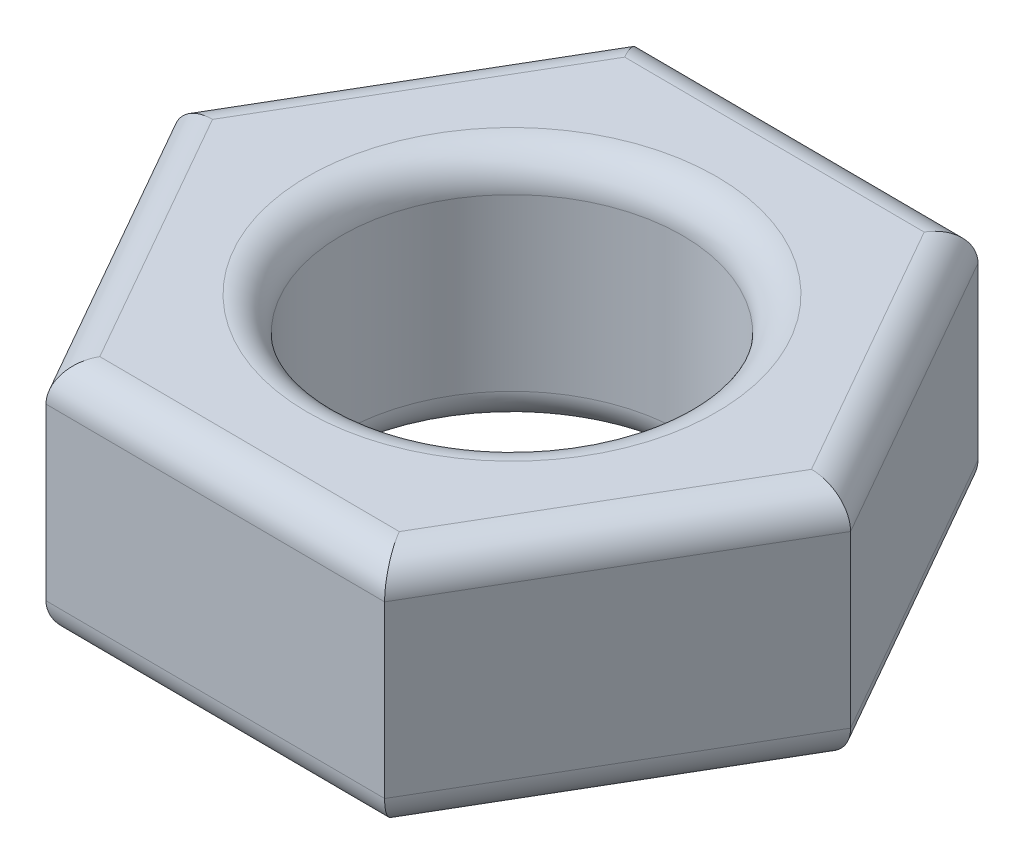
ISO-10303-21;
HEADER;
FILE_DESCRIPTION(('STEP AP214'),'2;1');
FILE_NAME('part.step','',(''),(''),'','','');
FILE_SCHEMA(('AUTOMOTIVE_DESIGN { 1 0 10303 214 1 1 1 1 }'));
ENDSEC;
DATA;
#1=APPLICATION_CONTEXT('core data for automotive mechanical design processes');
#2=APPLICATION_PROTOCOL_DEFINITION('international standard','automotive_design',2000,#1);
#3=PRODUCT_CONTEXT('',#1,'mechanical');
#4=PRODUCT('Part','Part','',(#3));
#5=PRODUCT_RELATED_PRODUCT_CATEGORY('part','',(#4));
#6=PRODUCT_DEFINITION_FORMATION('','',#4);
#7=PRODUCT_DEFINITION_CONTEXT('part definition',#1,'design');
#8=PRODUCT_DEFINITION('design','',#6,#7);
#9=PRODUCT_DEFINITION_SHAPE('','',#8);
#10=(LENGTH_UNIT() NAMED_UNIT(*) SI_UNIT(.MILLI.,.METRE.));
#11=(NAMED_UNIT(*) PLANE_ANGLE_UNIT() SI_UNIT($,.RADIAN.));
#12=(NAMED_UNIT(*) SI_UNIT($,.STERADIAN.) SOLID_ANGLE_UNIT());
#13=UNCERTAINTY_MEASURE_WITH_UNIT(LENGTH_MEASURE(1.E-05),#10,'distance_accuracy_value','');
#14=(GEOMETRIC_REPRESENTATION_CONTEXT(3) GLOBAL_UNCERTAINTY_ASSIGNED_CONTEXT((#13)) GLOBAL_UNIT_ASSIGNED_CONTEXT((#10,
#11,#12)) REPRESENTATION_CONTEXT('',''));
#15=CARTESIAN_POINT('',(0.,0.,0.));
#16=DIRECTION('',(0.,0.,1.));
#17=DIRECTION('',(1.,0.,0.));
#18=AXIS2_PLACEMENT_3D('',#15,#16,#17);
#19=CARTESIAN_POINT('',(0.,7.,0.));
#20=DIRECTION('',(0.,-1.,0.));
#21=DIRECTION('',(0.,0.,-1.));
#22=AXIS2_PLACEMENT_3D('',#19,#20,#21);
#23=PLANE('',#22);
#24=DIRECTION('',(-0.999982747889955,0.,-0.00587400395435439));
#25=VECTOR('',#24,1.);
#26=CARTESIAN_POINT('',(-4.95500275985404,7.,-7.68964181642976));
#27=LINE('',#26,#25);
#28=CARTESIAN_POINT('',(4.46765693146672,7.,-7.63429212124337));
#29=VERTEX_POINT('',#28);
#30=CARTESIAN_POINT('',(-4.3776624511748,7.,-7.68625045866549));
#31=VERTEX_POINT('',#30);
#32=EDGE_CURVE('E186',#29,#31,#27,.T.);
#33=ORIENTED_EDGE('',*,*,#32,.T.);
#34=DIRECTION('',(-0.505078410591378,0.,0.863073461041693));
#35=VECTOR('',#34,1.);
#36=CARTESIAN_POINT('',(-9.13692653895831,7.,0.446337357640725));
#37=LINE('',#36,#35);
#38=CARTESIAN_POINT('',(-8.84531938264151,7.,-0.0519583374221168));
#39=VERTEX_POINT('',#38);
#40=EDGE_CURVE('E167',#31,#39,#37,.T.);
#41=ORIENTED_EDGE('',*,*,#40,.T.);
#42=DIRECTION('',(0.494904337298576,0.,0.868947464996048));
#43=VECTOR('',#42,1.);
#44=CARTESIAN_POINT('',(-4.18192377910427,7.,8.13597917407048));
#45=LINE('',#44,#43);
#46=CARTESIAN_POINT('',(-4.46765693146672,7.,7.63429212124337));
#47=VERTEX_POINT('',#46);
#48=EDGE_CURVE('E175',#39,#47,#45,.T.);
#49=ORIENTED_EDGE('',*,*,#48,.T.);
#50=DIRECTION('',(0.999982747889955,0.,0.00587400395435474));
#51=VECTOR('',#50,1.);
#52=CARTESIAN_POINT('',(4.95500275985404,7.,7.68964181642976));
#53=LINE('',#52,#51);
#54=CARTESIAN_POINT('',(4.3776624511748,7.,7.68625045866549));
#55=VERTEX_POINT('',#54);
#56=EDGE_CURVE('E181',#47,#55,#53,.T.);
#57=ORIENTED_EDGE('',*,*,#56,.T.);
#58=DIRECTION('',(0.505078410591378,0.,-0.863073461041693));
#59=VECTOR('',#58,1.);
#60=CARTESIAN_POINT('',(9.13692653895831,7.,-0.446337357640723));
#61=LINE('',#60,#59);
#62=CARTESIAN_POINT('',(8.84531938264151,7.,0.0519583374221143));
#63=VERTEX_POINT('',#62);
#64=EDGE_CURVE('E307',#55,#63,#61,.T.);
#65=ORIENTED_EDGE('',*,*,#64,.T.);
#66=DIRECTION('',(-0.494904337298576,0.,-0.868947464996047));
#67=VECTOR('',#66,1.);
#68=CARTESIAN_POINT('',(4.18192377910427,7.,-8.13597917407048));
#69=LINE('',#68,#67);
#70=EDGE_CURVE('E191',#63,#29,#69,.T.);
#71=ORIENTED_EDGE('',*,*,#70,.T.);
#72=EDGE_LOOP('',(#33,#41,#49,#57,#65,#71));
#73=FACE_BOUND('',#72,.T.);
#74=CARTESIAN_POINT('',(0.,7.,0.));
#75=DIRECTION('',(0.,-1.,0.));
#76=DIRECTION('',(0.,0.,-1.));
#77=AXIS2_PLACEMENT_3D('',#74,#75,#76);
#78=CIRCLE('',#77,6.);
#79=CARTESIAN_POINT('',(0.,7.,-6.));
#80=VERTEX_POINT('',#79);
#81=EDGE_CURVE('E182',#80,#80,#78,.T.);
#82=ORIENTED_EDGE('',*,*,#81,.T.);
#83=EDGE_LOOP('',(#82));
#84=FACE_BOUND('',#83,.T.);
#85=ADVANCED_FACE('F71',(#73,#84),#23,.F.);
#86=CARTESIAN_POINT('',(0.,0.,0.));
#87=DIRECTION('',(0.,-1.,0.));
#88=DIRECTION('',(0.,0.,-1.));
#89=AXIS2_PLACEMENT_3D('',#86,#87,#88);
#90=PLANE('',#89);
#91=DIRECTION('',(-0.494904337298576,0.,-0.868947464996047));
#92=VECTOR('',#91,1.);
#93=CARTESIAN_POINT('',(6.65648815705411,0.,-3.79116689191063));
#94=LINE('',#93,#92);
#95=CARTESIAN_POINT('',(4.46765693146672,0.,-7.63429212124337));
#96=VERTEX_POINT('',#95);
#97=CARTESIAN_POINT('',(8.84531938264151,0.,0.0519583374221164));
#98=VERTEX_POINT('',#97);
#99=EDGE_CURVE('E88',#96,#98,#94,.F.);
#100=ORIENTED_EDGE('',*,*,#99,.T.);
#101=DIRECTION('',(0.505078410591378,0.,-0.863073461041693));
#102=VECTOR('',#101,1.);
#103=CARTESIAN_POINT('',(6.61149091690815,0.,3.86910439804381));
#104=LINE('',#103,#102);
#105=CARTESIAN_POINT('',(4.3776624511748,0.,7.68625045866549));
#106=VERTEX_POINT('',#105);
#107=EDGE_CURVE('E228',#98,#106,#104,.F.);
#108=ORIENTED_EDGE('',*,*,#107,.T.);
#109=DIRECTION('',(0.999982747889955,0.,0.00587400395435474));
#110=VECTOR('',#109,1.);
#111=CARTESIAN_POINT('',(-0.0449972401459611,0.,7.66027128995443));
#112=LINE('',#111,#110);
#113=CARTESIAN_POINT('',(-4.46765693146672,0.,7.63429212124337));
#114=VERTEX_POINT('',#113);
#115=EDGE_CURVE('E220',#106,#114,#112,.F.);
#116=ORIENTED_EDGE('',*,*,#115,.T.);
#117=DIRECTION('',(0.494904337298576,0.,0.868947464996048));
#118=VECTOR('',#117,1.);
#119=CARTESIAN_POINT('',(-6.65648815705411,0.,3.79116689191063));
#120=LINE('',#119,#118);
#121=CARTESIAN_POINT('',(-8.84531938264151,0.,-0.0519583374221165));
#122=VERTEX_POINT('',#121);
#123=EDGE_CURVE('E222',#114,#122,#120,.F.);
#124=ORIENTED_EDGE('',*,*,#123,.T.);
#125=DIRECTION('',(-0.505078410591378,0.,0.863073461041693));
#126=VECTOR('',#125,1.);
#127=CARTESIAN_POINT('',(-6.61149091690815,0.,-3.8691043980438));
#128=LINE('',#127,#126);
#129=CARTESIAN_POINT('',(-4.37766245117479,0.,-7.68625045866549));
#130=VERTEX_POINT('',#129);
#131=EDGE_CURVE('E224',#122,#130,#128,.F.);
#132=ORIENTED_EDGE('',*,*,#131,.T.);
#133=DIRECTION('',(-0.999982747889955,0.,-0.00587400395435439));
#134=VECTOR('',#133,1.);
#135=CARTESIAN_POINT('',(0.0449972401459585,0.,-7.66027128995443));
#136=LINE('',#135,#134);
#137=EDGE_CURVE('E93',#130,#96,#136,.F.);
#138=ORIENTED_EDGE('',*,*,#137,.T.);
#139=EDGE_LOOP('',(#100,#108,#116,#124,#132,#138));
#140=FACE_BOUND('',#139,.T.);
#141=CARTESIAN_POINT('',(0.,0.,0.));
#142=DIRECTION('',(0.,-1.,0.));
#143=DIRECTION('',(0.,0.,-1.));
#144=AXIS2_PLACEMENT_3D('',#141,#142,#143);
#145=CIRCLE('',#144,6.);
#146=CARTESIAN_POINT('',(0.,0.,-6.));
#147=VERTEX_POINT('',#146);
#148=EDGE_CURVE('E217',#147,#147,#145,.F.);
#149=ORIENTED_EDGE('',*,*,#148,.T.);
#150=EDGE_LOOP('',(#149));
#151=FACE_BOUND('',#150,.T.);
#152=ADVANCED_FACE('F269',(#140,#151),#90,.T.);
#153=CARTESIAN_POINT('',(0.,7.,0.));
#154=DIRECTION('',(0.,1.,0.));
#155=DIRECTION('',(0.,0.,1.));
#156=AXIS2_PLACEMENT_3D('',#153,#154,#155);
#157=CYLINDRICAL_SURFACE('',#156,5.);
#158=CARTESIAN_POINT('',(0.,1.,0.));
#159=DIRECTION('',(0.,-1.,0.));
#160=DIRECTION('',(0.,0.,-1.));
#161=AXIS2_PLACEMENT_3D('',#158,#159,#160);
#162=CIRCLE('',#161,5.);
#163=CARTESIAN_POINT('',(0.,1.,-5.));
#164=VERTEX_POINT('',#163);
#165=EDGE_CURVE('E12',#164,#164,#162,.T.);
#166=ORIENTED_EDGE('',*,*,#165,.T.);
#167=EDGE_LOOP('',(#166));
#168=FACE_BOUND('',#167,.T.);
#169=CARTESIAN_POINT('',(0.,6.,0.));
#170=DIRECTION('',(0.,-1.,0.));
#171=DIRECTION('',(0.,0.,-1.));
#172=AXIS2_PLACEMENT_3D('',#169,#170,#171);
#173=CIRCLE('',#172,5.);
#174=CARTESIAN_POINT('',(0.,6.,-5.));
#175=VERTEX_POINT('',#174);
#176=EDGE_CURVE('E80',#175,#175,#173,.F.);
#177=ORIENTED_EDGE('',*,*,#176,.T.);
#178=EDGE_LOOP('',(#177));
#179=FACE_BOUND('',#178,.T.);
#180=ADVANCED_FACE('F347',(#168,#179),#157,.F.);
#181=CARTESIAN_POINT('',(-7.47456437794984,0.,-4.37418280863518));
#182=DIRECTION('',(-0.863073461041693,0.,-0.505078410591378));
#183=DIRECTION('',(-0.505078410591378,0.,0.863073461041693));
#184=AXIS2_PLACEMENT_3D('',#181,#182,#183);
#185=PLANE('',#184);
#186=DIRECTION('',(0.,1.,0.));
#187=VECTOR('',#186,1.);
#188=CARTESIAN_POINT('',(-10.,0.,-0.0587410529506546));
#189=LINE('',#188,#187);
#190=CARTESIAN_POINT('',(-10.,1.,-0.0587410529506546));
#191=VERTEX_POINT('',#190);
#192=CARTESIAN_POINT('',(-10.,6.,-0.0587410529506546));
#193=VERTEX_POINT('',#192);
#194=EDGE_CURVE('E294',#191,#193,#189,.T.);
#195=ORIENTED_EDGE('',*,*,#194,.T.);
#196=DIRECTION('',(-0.505078410591378,0.,0.863073461041693));
#197=VECTOR('',#196,1.);
#198=CARTESIAN_POINT('',(-4.94912875589969,6.,-8.68962456431972));
#199=LINE('',#198,#197);
#200=CARTESIAN_POINT('',(-4.94912875589969,6.,-8.68962456431971));
#201=VERTEX_POINT('',#200);
#202=EDGE_CURVE('E169',#193,#201,#199,.F.);
#203=ORIENTED_EDGE('',*,*,#202,.T.);
#204=DIRECTION('',(0.,1.,0.));
#205=VECTOR('',#204,1.);
#206=CARTESIAN_POINT('',(-4.94912875589969,0.,-8.68962456431971));
#207=LINE('',#206,#205);
#208=CARTESIAN_POINT('',(-4.94912875589969,1.,-8.68962456431971));
#209=VERTEX_POINT('',#208);
#210=EDGE_CURVE('E291',#209,#201,#207,.T.);
#211=ORIENTED_EDGE('',*,*,#210,.F.);
#212=DIRECTION('',(-0.505078410591378,0.,0.863073461041693));
#213=VECTOR('',#212,1.);
#214=CARTESIAN_POINT('',(-7.47456437794984,1.,-4.37418280863518));
#215=LINE('',#214,#213);
#216=EDGE_CURVE('E188',#209,#191,#215,.T.);
#217=ORIENTED_EDGE('',*,*,#216,.T.);
#218=EDGE_LOOP('',(#195,#203,#211,#217));
#219=FACE_BOUND('',#218,.T.);
#220=ADVANCED_FACE('F322',(#219),#185,.T.);
#221=CARTESIAN_POINT('',(7.52543562205016,0.,-4.28607122920921));
#222=DIRECTION('',(0.868947464996047,0.,-0.494904337298576));
#223=DIRECTION('',(-0.494904337298576,0.,-0.868947464996047));
#224=AXIS2_PLACEMENT_3D('',#221,#222,#223);
#225=PLANE('',#224);
#226=DIRECTION('',(0.,1.,0.));
#227=VECTOR('',#226,1.);
#228=CARTESIAN_POINT('',(5.05087124410032,0.,-8.63088351136906));
#229=LINE('',#228,#227);
#230=CARTESIAN_POINT('',(5.05087124410032,1.,-8.63088351136906));
#231=VERTEX_POINT('',#230);
#232=CARTESIAN_POINT('',(5.05087124410032,6.,-8.63088351136906));
#233=VERTEX_POINT('',#232);
#234=EDGE_CURVE('E299',#231,#233,#229,.T.);
#235=ORIENTED_EDGE('',*,*,#234,.T.);
#236=DIRECTION('',(-0.494904337298576,0.,-0.868947464996047));
#237=VECTOR('',#236,1.);
#238=CARTESIAN_POINT('',(10.,6.,0.0587410529506549));
#239=LINE('',#238,#237);
#240=CARTESIAN_POINT('',(10.,6.,0.0587410529506576));
#241=VERTEX_POINT('',#240);
#242=EDGE_CURVE('E202',#233,#241,#239,.F.);
#243=ORIENTED_EDGE('',*,*,#242,.T.);
#244=DIRECTION('',(0.,1.,0.));
#245=VECTOR('',#244,1.);
#246=CARTESIAN_POINT('',(10.,0.,0.0587410529506576));
#247=LINE('',#246,#245);
#248=CARTESIAN_POINT('',(10.,1.,0.0587410529506576));
#249=VERTEX_POINT('',#248);
#250=EDGE_CURVE('E297',#249,#241,#247,.T.);
#251=ORIENTED_EDGE('',*,*,#250,.F.);
#252=DIRECTION('',(-0.494904337298576,0.,-0.868947464996047));
#253=VECTOR('',#252,1.);
#254=CARTESIAN_POINT('',(7.52543562205016,1.,-4.28607122920921));
#255=LINE('',#254,#253);
#256=EDGE_CURVE('E200',#249,#231,#255,.T.);
#257=ORIENTED_EDGE('',*,*,#256,.T.);
#258=EDGE_LOOP('',(#235,#243,#251,#257));
#259=FACE_BOUND('',#258,.T.);
#260=ADVANCED_FACE('F380',(#259),#225,.T.);
#261=CARTESIAN_POINT('',(0.0508712441003129,0.,-8.66025403784439));
#262=DIRECTION('',(0.00587400395435439,0.,-0.999982747889954));
#263=DIRECTION('',(-0.999982747889955,0.,-0.00587400395435439));
#264=AXIS2_PLACEMENT_3D('',#261,#262,#263);
#265=PLANE('',#264);
#266=ORIENTED_EDGE('',*,*,#210,.T.);
#267=DIRECTION('',(-0.999982747889955,0.,-0.00587400395435439));
#268=VECTOR('',#267,1.);
#269=CARTESIAN_POINT('',(5.05087124410032,6.,-8.63088351136906));
#270=LINE('',#269,#268);
#271=EDGE_CURVE('E198',#201,#233,#270,.F.);
#272=ORIENTED_EDGE('',*,*,#271,.T.);
#273=ORIENTED_EDGE('',*,*,#234,.F.);
#274=DIRECTION('',(-0.999982747889955,0.,-0.00587400395435439));
#275=VECTOR('',#274,1.);
#276=CARTESIAN_POINT('',(0.0508712441003129,1.,-8.66025403784439));
#277=LINE('',#276,#275);
#278=EDGE_CURVE('E196',#231,#209,#277,.T.);
#279=ORIENTED_EDGE('',*,*,#278,.T.);
#280=EDGE_LOOP('',(#266,#272,#273,#279));
#281=FACE_BOUND('',#280,.T.);
#282=ADVANCED_FACE('F324',(#281),#265,.T.);
#283=CARTESIAN_POINT('',(-7.52543562205016,0.,4.2860712292092));
#284=DIRECTION('',(-0.868947464996048,0.,0.494904337298576));
#285=DIRECTION('',(0.494904337298576,0.,0.868947464996048));
#286=AXIS2_PLACEMENT_3D('',#283,#284,#285);
#287=PLANE('',#286);
#288=DIRECTION('',(0.,1.,0.));
#289=VECTOR('',#288,1.);
#290=CARTESIAN_POINT('',(-5.05087124410032,0.,8.63088351136906));
#291=LINE('',#290,#289);
#292=CARTESIAN_POINT('',(-5.05087124410032,1.,8.63088351136906));
#293=VERTEX_POINT('',#292);
#294=CARTESIAN_POINT('',(-5.05087124410032,6.,8.63088351136906));
#295=VERTEX_POINT('',#294);
#296=EDGE_CURVE('E284',#293,#295,#291,.T.);
#297=ORIENTED_EDGE('',*,*,#296,.T.);
#298=DIRECTION('',(0.494904337298576,0.,0.868947464996048));
#299=VECTOR('',#298,1.);
#300=CARTESIAN_POINT('',(-10.,6.,-0.0587410529506551));
#301=LINE('',#300,#299);
#302=EDGE_CURVE('E215',#295,#193,#301,.F.);
#303=ORIENTED_EDGE('',*,*,#302,.T.);
#304=ORIENTED_EDGE('',*,*,#194,.F.);
#305=DIRECTION('',(0.494904337298576,0.,0.868947464996048));
#306=VECTOR('',#305,1.);
#307=CARTESIAN_POINT('',(-7.52543562205016,1.,4.2860712292092));
#308=LINE('',#307,#306);
#309=EDGE_CURVE('E213',#191,#293,#308,.T.);
#310=ORIENTED_EDGE('',*,*,#309,.T.);
#311=EDGE_LOOP('',(#297,#303,#304,#310));
#312=FACE_BOUND('',#311,.T.);
#313=ADVANCED_FACE('F372',(#312),#287,.T.);
#314=CARTESIAN_POINT('',(-0.0508712441003158,0.,8.66025403784439));
#315=DIRECTION('',(-0.00587400395435473,0.,0.999982747889954));
#316=DIRECTION('',(0.999982747889955,0.,0.00587400395435474));
#317=AXIS2_PLACEMENT_3D('',#314,#315,#316);
#318=PLANE('',#317);
#319=DIRECTION('',(0.,1.,0.));
#320=VECTOR('',#319,1.);
#321=CARTESIAN_POINT('',(4.94912875589969,0.,8.68962456431972));
#322=LINE('',#321,#320);
#323=CARTESIAN_POINT('',(4.94912875589969,1.,8.68962456431972));
#324=VERTEX_POINT('',#323);
#325=CARTESIAN_POINT('',(4.94912875589969,6.,8.68962456431972));
#326=VERTEX_POINT('',#325);
#327=EDGE_CURVE('E243',#324,#326,#322,.T.);
#328=ORIENTED_EDGE('',*,*,#327,.T.);
#329=DIRECTION('',(0.999982747889955,0.,0.00587400395435474));
#330=VECTOR('',#329,1.);
#331=CARTESIAN_POINT('',(-5.05087124410032,6.,8.63088351136906));
#332=LINE('',#331,#330);
#333=EDGE_CURVE('E211',#326,#295,#332,.F.);
#334=ORIENTED_EDGE('',*,*,#333,.T.);
#335=ORIENTED_EDGE('',*,*,#296,.F.);
#336=DIRECTION('',(0.999982747889955,0.,0.00587400395435474));
#337=VECTOR('',#336,1.);
#338=CARTESIAN_POINT('',(-0.0508712441003158,1.,8.66025403784439));
#339=LINE('',#338,#337);
#340=EDGE_CURVE('E209',#293,#324,#339,.T.);
#341=ORIENTED_EDGE('',*,*,#340,.T.);
#342=EDGE_LOOP('',(#328,#334,#335,#341));
#343=FACE_BOUND('',#342,.T.);
#344=ADVANCED_FACE('F281',(#343),#318,.T.);
#345=CARTESIAN_POINT('',(7.47456437794985,0.,4.37418280863518));
#346=DIRECTION('',(0.863073461041693,0.,0.505078410591378));
#347=DIRECTION('',(0.505078410591378,0.,-0.863073461041693));
#348=AXIS2_PLACEMENT_3D('',#345,#346,#347);
#349=PLANE('',#348);
#350=ORIENTED_EDGE('',*,*,#250,.T.);
#351=DIRECTION('',(0.505078410591378,0.,-0.863073461041693));
#352=VECTOR('',#351,1.);
#353=CARTESIAN_POINT('',(4.94912875589969,6.,8.68962456431972));
#354=LINE('',#353,#352);
#355=EDGE_CURVE('E207',#241,#326,#354,.F.);
#356=ORIENTED_EDGE('',*,*,#355,.T.);
#357=ORIENTED_EDGE('',*,*,#327,.F.);
#358=DIRECTION('',(0.505078410591378,0.,-0.863073461041693));
#359=VECTOR('',#358,1.);
#360=CARTESIAN_POINT('',(7.47456437794985,1.,4.37418280863518));
#361=LINE('',#360,#359);
#362=EDGE_CURVE('E204',#324,#249,#361,.T.);
#363=ORIENTED_EDGE('',*,*,#362,.T.);
#364=EDGE_LOOP('',(#350,#356,#357,#363));
#365=FACE_BOUND('',#364,.T.);
#366=ADVANCED_FACE('F287',(#365),#349,.T.);
#367=CARTESIAN_POINT('',(6.61149091690815,6.,3.86910439804381));
#368=DIRECTION('',(-0.505078410591378,0.,0.863073461041693));
#369=DIRECTION('',(0.863073461041693,0.,0.505078410591378));
#370=AXIS2_PLACEMENT_3D('',#367,#368,#369);
#371=CYLINDRICAL_SURFACE('',#370,1.);
#372=CARTESIAN_POINT('',(4.3776624511748,6.,7.68625045866549));
#373=DIRECTION('',(-0.868947464996048,0.,0.494904337298576));
#374=DIRECTION('',(-0.494904337298576,0.,-0.868947464996048));
#375=AXIS2_PLACEMENT_3D('',#372,#373,#374);
#376=ELLIPSE('',#375,1.15470053837925,1.);
#377=EDGE_CURVE('E237',#326,#55,#376,.T.);
#378=ORIENTED_EDGE('',*,*,#377,.F.);
#379=ORIENTED_EDGE('',*,*,#355,.F.);
#380=CARTESIAN_POINT('',(8.84531938264151,6.,0.0519583374221156));
#381=DIRECTION('',(-0.00587400395435429,0.,0.999982747889955));
#382=DIRECTION('',(-0.999982747889955,0.,-0.00587400395435422));
#383=AXIS2_PLACEMENT_3D('',#380,#381,#382);
#384=ELLIPSE('',#383,1.15470053837925,1.);
#385=EDGE_CURVE('E240',#63,#241,#384,.F.);
#386=ORIENTED_EDGE('',*,*,#385,.F.);
#387=ORIENTED_EDGE('',*,*,#64,.F.);
#388=EDGE_LOOP('',(#378,#379,#386,#387));
#389=FACE_BOUND('',#388,.T.);
#390=ADVANCED_FACE('F363',(#389),#371,.T.);
#391=CARTESIAN_POINT('',(6.65648815705411,6.,-3.79116689191063));
#392=DIRECTION('',(0.494904337298576,0.,0.868947464996047));
#393=DIRECTION('',(0.868947464996047,0.,-0.494904337298576));
#394=AXIS2_PLACEMENT_3D('',#391,#392,#393);
#395=CYLINDRICAL_SURFACE('',#394,1.);
#396=ORIENTED_EDGE('',*,*,#385,.T.);
#397=ORIENTED_EDGE('',*,*,#242,.F.);
#398=CARTESIAN_POINT('',(4.46765693146672,6.,-7.63429212124337));
#399=DIRECTION('',(0.863073461041693,0.,0.505078410591378));
#400=DIRECTION('',(-0.505078410591378,0.,0.863073461041693));
#401=AXIS2_PLACEMENT_3D('',#398,#399,#400);
#402=ELLIPSE('',#401,1.15470053837925,1.);
#403=EDGE_CURVE('E234',#29,#233,#402,.F.);
#404=ORIENTED_EDGE('',*,*,#403,.F.);
#405=ORIENTED_EDGE('',*,*,#70,.F.);
#406=EDGE_LOOP('',(#396,#397,#404,#405));
#407=FACE_BOUND('',#406,.T.);
#408=ADVANCED_FACE('F314',(#407),#395,.T.);
#409=CARTESIAN_POINT('',(-0.0449972401459611,6.,7.66027128995443));
#410=DIRECTION('',(-0.999982747889955,0.,-0.00587400395435474));
#411=DIRECTION('',(-0.00587400395435473,0.,0.999982747889954));
#412=AXIS2_PLACEMENT_3D('',#409,#410,#411);
#413=CYLINDRICAL_SURFACE('',#412,1.);
#414=ORIENTED_EDGE('',*,*,#377,.T.);
#415=ORIENTED_EDGE('',*,*,#56,.F.);
#416=CARTESIAN_POINT('',(-4.46765693146672,6.,7.63429212124337));
#417=DIRECTION('',(-0.863073461041693,0.,-0.505078410591379));
#418=DIRECTION('',(0.505078410591379,0.,-0.863073461041693));
#419=AXIS2_PLACEMENT_3D('',#416,#417,#418);
#420=ELLIPSE('',#419,1.15470053837925,1.);
#421=EDGE_CURVE('E178',#295,#47,#420,.T.);
#422=ORIENTED_EDGE('',*,*,#421,.F.);
#423=ORIENTED_EDGE('',*,*,#333,.F.);
#424=EDGE_LOOP('',(#414,#415,#422,#423));
#425=FACE_BOUND('',#424,.T.);
#426=ADVANCED_FACE('F358',(#425),#413,.T.);
#427=CARTESIAN_POINT('',(0.0449972401459585,6.,-7.66027128995443));
#428=DIRECTION('',(0.999982747889955,0.,0.00587400395435439));
#429=DIRECTION('',(0.00587400395435439,0.,-0.999982747889954));
#430=AXIS2_PLACEMENT_3D('',#427,#428,#429);
#431=CYLINDRICAL_SURFACE('',#430,1.);
#432=ORIENTED_EDGE('',*,*,#403,.T.);
#433=ORIENTED_EDGE('',*,*,#271,.F.);
#434=CARTESIAN_POINT('',(-4.37766245117479,6.,-7.68625045866549));
#435=DIRECTION('',(0.868947464996047,0.,-0.494904337298576));
#436=DIRECTION('',(0.494904337298576,0.,0.868947464996047));
#437=AXIS2_PLACEMENT_3D('',#434,#435,#436);
#438=ELLIPSE('',#437,1.15470053837925,1.);
#439=EDGE_CURVE('E172',#31,#201,#438,.F.);
#440=ORIENTED_EDGE('',*,*,#439,.F.);
#441=ORIENTED_EDGE('',*,*,#32,.F.);
#442=EDGE_LOOP('',(#432,#433,#440,#441));
#443=FACE_BOUND('',#442,.T.);
#444=ADVANCED_FACE('F317',(#443),#431,.T.);
#445=CARTESIAN_POINT('',(-6.65648815705411,6.,3.79116689191063));
#446=DIRECTION('',(-0.494904337298576,0.,-0.868947464996048));
#447=DIRECTION('',(-0.868947464996048,0.,0.494904337298576));
#448=AXIS2_PLACEMENT_3D('',#445,#446,#447);
#449=CYLINDRICAL_SURFACE('',#448,1.);
#450=ORIENTED_EDGE('',*,*,#421,.T.);
#451=ORIENTED_EDGE('',*,*,#48,.F.);
#452=CARTESIAN_POINT('',(-8.84531938264151,6.,-0.0519583374221171));
#453=DIRECTION('',(0.00587400395435445,0.,-0.999982747889954));
#454=DIRECTION('',(-0.999982747889955,0.,-0.00587400395435445));
#455=AXIS2_PLACEMENT_3D('',#452,#453,#454);
#456=ELLIPSE('',#455,1.15470053837925,1.);
#457=EDGE_CURVE('E163',#193,#39,#456,.T.);
#458=ORIENTED_EDGE('',*,*,#457,.F.);
#459=ORIENTED_EDGE('',*,*,#302,.F.);
#460=EDGE_LOOP('',(#450,#451,#458,#459));
#461=FACE_BOUND('',#460,.T.);
#462=ADVANCED_FACE('F176',(#461),#449,.T.);
#463=CARTESIAN_POINT('',(-6.61149091690815,6.,-3.8691043980438));
#464=DIRECTION('',(0.505078410591378,0.,-0.863073461041693));
#465=DIRECTION('',(-0.863073461041693,0.,-0.505078410591378));
#466=AXIS2_PLACEMENT_3D('',#463,#464,#465);
#467=CYLINDRICAL_SURFACE('',#466,1.);
#468=ORIENTED_EDGE('',*,*,#439,.T.);
#469=ORIENTED_EDGE('',*,*,#202,.F.);
#470=ORIENTED_EDGE('',*,*,#457,.T.);
#471=ORIENTED_EDGE('',*,*,#40,.F.);
#472=EDGE_LOOP('',(#468,#469,#470,#471));
#473=FACE_BOUND('',#472,.T.);
#474=ADVANCED_FACE('F165',(#473),#467,.T.);
#475=CARTESIAN_POINT('',(-6.61149091690815,1.,-3.86910439804381));
#476=DIRECTION('',(-0.505078410591378,0.,0.863073461041693));
#477=DIRECTION('',(0.863073461041693,0.,0.505078410591378));
#478=AXIS2_PLACEMENT_3D('',#475,#476,#477);
#479=CYLINDRICAL_SURFACE('',#478,1.);
#480=CARTESIAN_POINT('',(-4.3776624511748,1.,-7.68625045866549));
#481=DIRECTION('',(-0.868947464996047,0.,0.494904337298576));
#482=DIRECTION('',(0.494904337298576,0.,0.868947464996047));
#483=AXIS2_PLACEMENT_3D('',#480,#481,#482);
#484=ELLIPSE('',#483,1.15470053837925,1.);
#485=EDGE_CURVE('E253',#130,#209,#484,.F.);
#486=ORIENTED_EDGE('',*,*,#485,.F.);
#487=ORIENTED_EDGE('',*,*,#131,.F.);
#488=CARTESIAN_POINT('',(-8.84531938264151,1.,-0.0519583374221173));
#489=DIRECTION('',(-0.00587400395435445,0.,0.999982747889954));
#490=DIRECTION('',(0.999982747889955,0.,0.00587400395435445));
#491=AXIS2_PLACEMENT_3D('',#488,#489,#490);
#492=ELLIPSE('',#491,1.15470053837925,1.);
#493=EDGE_CURVE('E75',#191,#122,#492,.T.);
#494=ORIENTED_EDGE('',*,*,#493,.F.);
#495=ORIENTED_EDGE('',*,*,#216,.F.);
#496=EDGE_LOOP('',(#486,#487,#494,#495));
#497=FACE_BOUND('',#496,.T.);
#498=ADVANCED_FACE('F268',(#497),#479,.T.);
#499=CARTESIAN_POINT('',(-6.65648815705411,1.,3.79116689191063));
#500=DIRECTION('',(0.494904337298576,0.,0.868947464996048));
#501=DIRECTION('',(0.868947464996048,0.,-0.494904337298576));
#502=AXIS2_PLACEMENT_3D('',#499,#500,#501);
#503=CYLINDRICAL_SURFACE('',#502,1.);
#504=ORIENTED_EDGE('',*,*,#493,.T.);
#505=ORIENTED_EDGE('',*,*,#123,.F.);
#506=CARTESIAN_POINT('',(-4.46765693146672,1.,7.63429212124337));
#507=DIRECTION('',(0.863073461041693,0.,0.505078410591379));
#508=DIRECTION('',(0.505078410591379,0.,-0.863073461041693));
#509=AXIS2_PLACEMENT_3D('',#506,#507,#508);
#510=ELLIPSE('',#509,1.15470053837925,1.);
#511=EDGE_CURVE('E251',#293,#114,#510,.T.);
#512=ORIENTED_EDGE('',*,*,#511,.F.);
#513=ORIENTED_EDGE('',*,*,#309,.F.);
#514=EDGE_LOOP('',(#504,#505,#512,#513));
#515=FACE_BOUND('',#514,.T.);
#516=ADVANCED_FACE('F263',(#515),#503,.T.);
#517=CARTESIAN_POINT('',(0.0449972401459585,1.,-7.66027128995443));
#518=DIRECTION('',(-0.999982747889955,0.,-0.00587400395435439));
#519=DIRECTION('',(-0.00587400395435439,0.,0.999982747889954));
#520=AXIS2_PLACEMENT_3D('',#517,#518,#519);
#521=CYLINDRICAL_SURFACE('',#520,1.);
#522=ORIENTED_EDGE('',*,*,#485,.T.);
#523=ORIENTED_EDGE('',*,*,#278,.F.);
#524=CARTESIAN_POINT('',(4.46765693146672,1.,-7.63429212124337));
#525=DIRECTION('',(-0.863073461041693,0.,-0.505078410591378));
#526=DIRECTION('',(-0.505078410591378,0.,0.863073461041693));
#527=AXIS2_PLACEMENT_3D('',#524,#525,#526);
#528=ELLIPSE('',#527,1.15470053837925,1.);
#529=EDGE_CURVE('E248',#96,#231,#528,.F.);
#530=ORIENTED_EDGE('',*,*,#529,.F.);
#531=ORIENTED_EDGE('',*,*,#137,.F.);
#532=EDGE_LOOP('',(#522,#523,#530,#531));
#533=FACE_BOUND('',#532,.T.);
#534=ADVANCED_FACE('F325',(#533),#521,.T.);
#535=CARTESIAN_POINT('',(-0.0449972401459611,1.,7.66027128995443));
#536=DIRECTION('',(0.999982747889955,0.,0.00587400395435474));
#537=DIRECTION('',(0.00587400395435473,0.,-0.999982747889954));
#538=AXIS2_PLACEMENT_3D('',#535,#536,#537);
#539=CYLINDRICAL_SURFACE('',#538,1.);
#540=ORIENTED_EDGE('',*,*,#511,.T.);
#541=ORIENTED_EDGE('',*,*,#115,.F.);
#542=CARTESIAN_POINT('',(4.3776624511748,1.,7.68625045866549));
#543=DIRECTION('',(0.868947464996048,0.,-0.494904337298576));
#544=DIRECTION('',(0.494904337298576,0.,0.868947464996048));
#545=AXIS2_PLACEMENT_3D('',#542,#543,#544);
#546=ELLIPSE('',#545,1.15470053837925,1.);
#547=EDGE_CURVE('E246',#324,#106,#546,.T.);
#548=ORIENTED_EDGE('',*,*,#547,.F.);
#549=ORIENTED_EDGE('',*,*,#340,.F.);
#550=EDGE_LOOP('',(#540,#541,#548,#549));
#551=FACE_BOUND('',#550,.T.);
#552=ADVANCED_FACE('F274',(#551),#539,.T.);
#553=CARTESIAN_POINT('',(6.65648815705411,1.,-3.79116689191063));
#554=DIRECTION('',(-0.494904337298576,0.,-0.868947464996047));
#555=DIRECTION('',(-0.868947464996047,0.,0.494904337298576));
#556=AXIS2_PLACEMENT_3D('',#553,#554,#555);
#557=CYLINDRICAL_SURFACE('',#556,1.);
#558=ORIENTED_EDGE('',*,*,#529,.T.);
#559=ORIENTED_EDGE('',*,*,#256,.F.);
#560=CARTESIAN_POINT('',(8.84531938264151,1.,0.0519583374221154));
#561=DIRECTION('',(0.00587400395435429,0.,-0.999982747889955));
#562=DIRECTION('',(-0.999982747889955,0.,-0.00587400395435422));
#563=AXIS2_PLACEMENT_3D('',#560,#561,#562);
#564=ELLIPSE('',#563,1.15470053837925,1.);
#565=EDGE_CURVE('E244',#98,#249,#564,.F.);
#566=ORIENTED_EDGE('',*,*,#565,.F.);
#567=ORIENTED_EDGE('',*,*,#99,.F.);
#568=EDGE_LOOP('',(#558,#559,#566,#567));
#569=FACE_BOUND('',#568,.T.);
#570=ADVANCED_FACE('F328',(#569),#557,.T.);
#571=CARTESIAN_POINT('',(6.61149091690815,1.,3.86910439804381));
#572=DIRECTION('',(0.505078410591378,0.,-0.863073461041693));
#573=DIRECTION('',(-0.863073461041693,0.,-0.505078410591378));
#574=AXIS2_PLACEMENT_3D('',#571,#572,#573);
#575=CYLINDRICAL_SURFACE('',#574,1.);
#576=ORIENTED_EDGE('',*,*,#547,.T.);
#577=ORIENTED_EDGE('',*,*,#107,.F.);
#578=ORIENTED_EDGE('',*,*,#565,.T.);
#579=ORIENTED_EDGE('',*,*,#362,.F.);
#580=EDGE_LOOP('',(#576,#577,#578,#579));
#581=FACE_BOUND('',#580,.T.);
#582=ADVANCED_FACE('F331',(#581),#575,.T.);
#583=CARTESIAN_POINT('',(0.,1.,0.));
#584=DIRECTION('',(0.,-1.,0.));
#585=DIRECTION('',(0.,0.,-1.));
#586=AXIS2_PLACEMENT_3D('',#583,#584,#585);
#587=TOROIDAL_SURFACE('',#586,6.,1.);
#588=ORIENTED_EDGE('',*,*,#165,.F.);
#589=EDGE_LOOP('',(#588));
#590=FACE_BOUND('',#589,.T.);
#591=ORIENTED_EDGE('',*,*,#148,.F.);
#592=EDGE_LOOP('',(#591));
#593=FACE_BOUND('',#592,.T.);
#594=ADVANCED_FACE('F333',(#590,#593),#587,.T.);
#595=CARTESIAN_POINT('',(0.,6.,0.));
#596=DIRECTION('',(0.,-1.,0.));
#597=DIRECTION('',(0.,0.,-1.));
#598=AXIS2_PLACEMENT_3D('',#595,#596,#597);
#599=TOROIDAL_SURFACE('',#598,6.,1.);
#600=ORIENTED_EDGE('',*,*,#81,.F.);
#601=EDGE_LOOP('',(#600));
#602=FACE_BOUND('',#601,.T.);
#603=ORIENTED_EDGE('',*,*,#176,.F.);
#604=EDGE_LOOP('',(#603));
#605=FACE_BOUND('',#604,.T.);
#606=ADVANCED_FACE('F73',(#602,#605),#599,.T.);
#607=CLOSED_SHELL('',(#85,#152,#180,#220,#260,#282,#313,#344,#366,#390,#408,#426,#444,#462,#474,
#498,#516,#534,#552,#570,#582,#594,#606));
#608=MANIFOLD_SOLID_BREP('B2',#607);
#609=ADVANCED_BREP_SHAPE_REPRESENTATION('',(#18,#608),#14);
#610=SHAPE_DEFINITION_REPRESENTATION(#9,#609);
ENDSEC;
END-ISO-10303-21;
